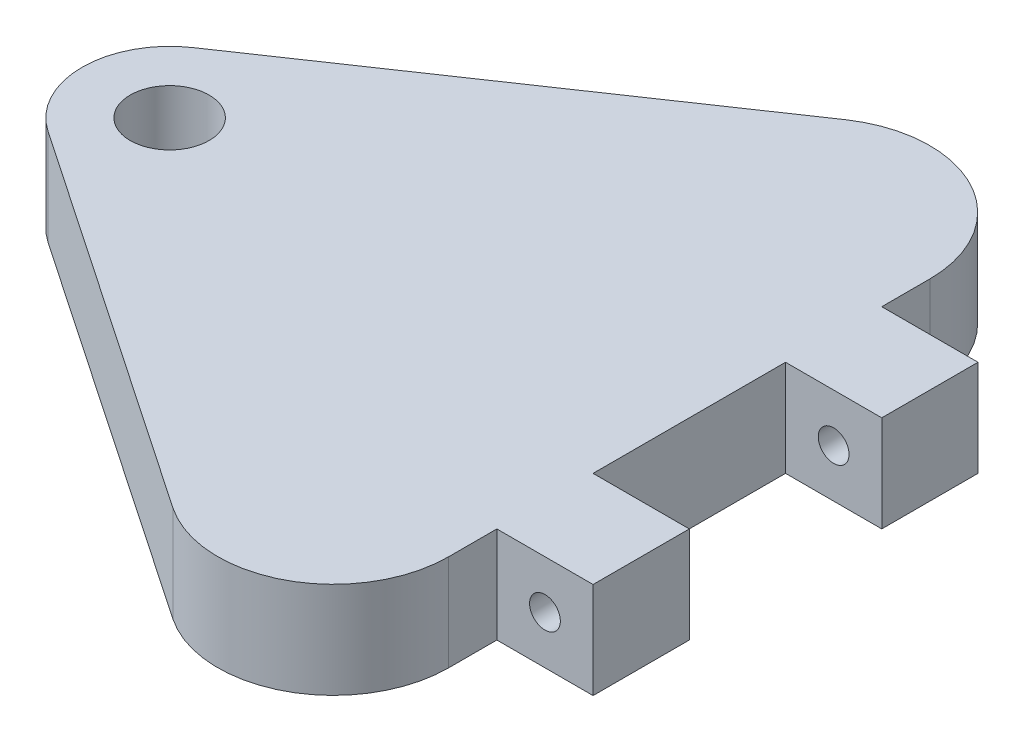
ISO-10303-21;
HEADER;
FILE_DESCRIPTION(('STEP AP214'),'2;1');
FILE_NAME('part.step','',(''),(''),'','','');
FILE_SCHEMA(('AUTOMOTIVE_DESIGN { 1 0 10303 214 1 1 1 1 }'));
ENDSEC;
DATA;
#1=APPLICATION_CONTEXT('core data for automotive mechanical design processes');
#2=APPLICATION_PROTOCOL_DEFINITION('international standard','automotive_design',2000,#1);
#3=PRODUCT_CONTEXT('',#1,'mechanical');
#4=PRODUCT('Part','Part','',(#3));
#5=PRODUCT_RELATED_PRODUCT_CATEGORY('part','',(#4));
#6=PRODUCT_DEFINITION_FORMATION('','',#4);
#7=PRODUCT_DEFINITION_CONTEXT('part definition',#1,'design');
#8=PRODUCT_DEFINITION('design','',#6,#7);
#9=PRODUCT_DEFINITION_SHAPE('','',#8);
#10=(LENGTH_UNIT() NAMED_UNIT(*) SI_UNIT(.MILLI.,.METRE.));
#11=(NAMED_UNIT(*) PLANE_ANGLE_UNIT() SI_UNIT($,.RADIAN.));
#12=(NAMED_UNIT(*) SI_UNIT($,.STERADIAN.) SOLID_ANGLE_UNIT());
#13=UNCERTAINTY_MEASURE_WITH_UNIT(LENGTH_MEASURE(1.E-05),#10,'distance_accuracy_value','');
#14=(GEOMETRIC_REPRESENTATION_CONTEXT(3) GLOBAL_UNCERTAINTY_ASSIGNED_CONTEXT((#13)) GLOBAL_UNIT_ASSIGNED_CONTEXT((#10,
#11,#12)) REPRESENTATION_CONTEXT('',''));
#15=CARTESIAN_POINT('',(0.,0.,0.));
#16=DIRECTION('',(0.,0.,1.));
#17=DIRECTION('',(1.,0.,0.));
#18=AXIS2_PLACEMENT_3D('',#15,#16,#17);
#19=CARTESIAN_POINT('',(12.,10.,-25.));
#20=DIRECTION('',(-1.,0.,0.));
#21=DIRECTION('',(0.,0.,1.));
#22=AXIS2_PLACEMENT_3D('',#19,#20,#21);
#23=PLANE('',#22);
#24=DIRECTION('',(0.,-1.,0.));
#25=VECTOR('',#24,1.);
#26=CARTESIAN_POINT('',(12.,10.,-10.));
#27=LINE('',#26,#25);
#28=CARTESIAN_POINT('',(12.,10.,-10.));
#29=VERTEX_POINT('',#28);
#30=CARTESIAN_POINT('',(12.,0.,-10.));
#31=VERTEX_POINT('',#30);
#32=EDGE_CURVE('E57',#29,#31,#27,.T.);
#33=ORIENTED_EDGE('',*,*,#32,.F.);
#34=DIRECTION('',(0.,0.,-1.));
#35=VECTOR('',#34,1.);
#36=CARTESIAN_POINT('',(12.,10.,-25.));
#37=LINE('',#36,#35);
#38=CARTESIAN_POINT('',(12.,10.,10.));
#39=VERTEX_POINT('',#38);
#40=EDGE_CURVE('E377',#39,#29,#37,.T.);
#41=ORIENTED_EDGE('',*,*,#40,.F.);
#42=DIRECTION('',(0.,1.,0.));
#43=VECTOR('',#42,1.);
#44=CARTESIAN_POINT('',(12.,10.,10.));
#45=LINE('',#44,#43);
#46=CARTESIAN_POINT('',(12.,0.,10.));
#47=VERTEX_POINT('',#46);
#48=EDGE_CURVE('E237',#47,#39,#45,.T.);
#49=ORIENTED_EDGE('',*,*,#48,.F.);
#50=DIRECTION('',(0.,0.,-1.));
#51=VECTOR('',#50,1.);
#52=CARTESIAN_POINT('',(12.,0.,-25.));
#53=LINE('',#52,#51);
#54=EDGE_CURVE('E393',#47,#31,#53,.T.);
#55=ORIENTED_EDGE('',*,*,#54,.T.);
#56=EDGE_LOOP('',(#33,#41,#49,#55));
#57=FACE_BOUND('',#56,.T.);
#58=ADVANCED_FACE('F33',(#57),#23,.F.);
#59=DIRECTION('',(0.,1.,0.));
#60=VECTOR('',#59,1.);
#61=CARTESIAN_POINT('',(12.,10.,-20.));
#62=LINE('',#61,#60);
#63=CARTESIAN_POINT('',(12.,0.,-20.));
#64=VERTEX_POINT('',#63);
#65=CARTESIAN_POINT('',(12.,10.,-20.));
#66=VERTEX_POINT('',#65);
#67=EDGE_CURVE('E231',#64,#66,#62,.T.);
#68=ORIENTED_EDGE('',*,*,#67,.F.);
#69=CARTESIAN_POINT('',(12.,0.,-25.));
#70=VERTEX_POINT('',#69);
#71=EDGE_CURVE('E388',#64,#70,#53,.T.);
#72=ORIENTED_EDGE('',*,*,#71,.T.);
#73=DIRECTION('',(0.,-1.,0.));
#74=VECTOR('',#73,1.);
#75=CARTESIAN_POINT('',(12.,10.,-25.));
#76=LINE('',#75,#74);
#77=CARTESIAN_POINT('',(12.,10.,-25.));
#78=VERTEX_POINT('',#77);
#79=EDGE_CURVE('E401',#78,#70,#76,.T.);
#80=ORIENTED_EDGE('',*,*,#79,.F.);
#81=EDGE_CURVE('E49',#66,#78,#37,.T.);
#82=ORIENTED_EDGE('',*,*,#81,.F.);
#83=EDGE_LOOP('',(#68,#72,#80,#82));
#84=FACE_BOUND('',#83,.T.);
#85=ADVANCED_FACE('F441',(#84),#23,.F.);
#86=DIRECTION('',(0.,-1.,0.));
#87=VECTOR('',#86,1.);
#88=CARTESIAN_POINT('',(12.,10.,20.));
#89=LINE('',#88,#87);
#90=CARTESIAN_POINT('',(12.,10.,20.));
#91=VERTEX_POINT('',#90);
#92=CARTESIAN_POINT('',(12.,0.,20.));
#93=VERTEX_POINT('',#92);
#94=EDGE_CURVE('E234',#91,#93,#89,.T.);
#95=ORIENTED_EDGE('',*,*,#94,.F.);
#96=CARTESIAN_POINT('',(12.,10.,25.));
#97=VERTEX_POINT('',#96);
#98=EDGE_CURVE('E373',#97,#91,#37,.T.);
#99=ORIENTED_EDGE('',*,*,#98,.F.);
#100=DIRECTION('',(0.,-1.,0.));
#101=VECTOR('',#100,1.);
#102=CARTESIAN_POINT('',(12.,10.,25.));
#103=LINE('',#102,#101);
#104=CARTESIAN_POINT('',(12.,0.,25.));
#105=VERTEX_POINT('',#104);
#106=EDGE_CURVE('E404',#97,#105,#103,.T.);
#107=ORIENTED_EDGE('',*,*,#106,.T.);
#108=EDGE_CURVE('E389',#105,#93,#53,.T.);
#109=ORIENTED_EDGE('',*,*,#108,.T.);
#110=EDGE_LOOP('',(#95,#99,#107,#109));
#111=FACE_BOUND('',#110,.T.);
#112=ADVANCED_FACE('F419',(#111),#23,.F.);
#113=CARTESIAN_POINT('',(-42.,10.,0.));
#114=DIRECTION('',(0.,1.,0.));
#115=DIRECTION('',(0.,0.,1.));
#116=AXIS2_PLACEMENT_3D('',#113,#114,#115);
#117=PLANE('',#116);
#118=CARTESIAN_POINT('',(-42.,10.,0.));
#119=DIRECTION('',(0.,1.,0.));
#120=DIRECTION('',(0.,0.,1.));
#121=AXIS2_PLACEMENT_3D('',#118,#119,#120);
#122=CIRCLE('',#121,9.1);
#123=CARTESIAN_POINT('',(-47.1102547182687,10.,-7.52962792669148));
#124=VERTEX_POINT('',#123);
#125=CARTESIAN_POINT('',(-47.1102547182687,10.,7.52962792669148));
#126=VERTEX_POINT('',#125);
#127=EDGE_CURVE('E365',#124,#126,#122,.T.);
#128=ORIENTED_EDGE('',*,*,#127,.T.);
#129=DIRECTION('',(0.827431640295766,0.,0.561566452557004));
#130=VECTOR('',#129,1.);
#131=CARTESIAN_POINT('',(-6.73879743068405,10.,34.9291796835492));
#132=LINE('',#131,#130);
#133=CARTESIAN_POINT('',(-6.73879743068404,10.,34.9291796835492));
#134=VERTEX_POINT('',#133);
#135=EDGE_CURVE('E368',#126,#134,#132,.T.);
#136=ORIENTED_EDGE('',*,*,#135,.T.);
#137=CARTESIAN_POINT('',(0.,10.,25.));
#138=DIRECTION('',(0.,1.,0.));
#139=DIRECTION('',(0.,0.,1.));
#140=AXIS2_PLACEMENT_3D('',#137,#138,#139);
#141=CIRCLE('',#140,12.);
#142=EDGE_CURVE('E371',#134,#97,#141,.T.);
#143=ORIENTED_EDGE('',*,*,#142,.T.);
#144=ORIENTED_EDGE('',*,*,#98,.T.);
#145=DIRECTION('',(-1.,0.,0.));
#146=VECTOR('',#145,1.);
#147=CARTESIAN_POINT('',(22.,10.,20.));
#148=LINE('',#147,#146);
#149=CARTESIAN_POINT('',(22.,10.,20.));
#150=VERTEX_POINT('',#149);
#151=EDGE_CURVE('E251',#150,#91,#148,.T.);
#152=ORIENTED_EDGE('',*,*,#151,.F.);
#153=DIRECTION('',(0.,0.,1.));
#154=VECTOR('',#153,1.);
#155=CARTESIAN_POINT('',(22.,10.,20.));
#156=LINE('',#155,#154);
#157=CARTESIAN_POINT('',(22.,10.,10.));
#158=VERTEX_POINT('',#157);
#159=EDGE_CURVE('E250',#158,#150,#156,.T.);
#160=ORIENTED_EDGE('',*,*,#159,.F.);
#161=DIRECTION('',(-1.,0.,0.));
#162=VECTOR('',#161,1.);
#163=CARTESIAN_POINT('',(22.,10.,10.));
#164=LINE('',#163,#162);
#165=EDGE_CURVE('E256',#158,#39,#164,.T.);
#166=ORIENTED_EDGE('',*,*,#165,.T.);
#167=ORIENTED_EDGE('',*,*,#40,.T.);
#168=DIRECTION('',(-1.,0.,0.));
#169=VECTOR('',#168,1.);
#170=CARTESIAN_POINT('',(22.,10.,-10.));
#171=LINE('',#170,#169);
#172=CARTESIAN_POINT('',(22.,10.,-10.));
#173=VERTEX_POINT('',#172);
#174=EDGE_CURVE('E588',#173,#29,#171,.T.);
#175=ORIENTED_EDGE('',*,*,#174,.F.);
#176=DIRECTION('',(0.,0.,1.));
#177=VECTOR('',#176,1.);
#178=CARTESIAN_POINT('',(22.,10.,-10.));
#179=LINE('',#178,#177);
#180=CARTESIAN_POINT('',(22.,10.,-20.));
#181=VERTEX_POINT('',#180);
#182=EDGE_CURVE('E227',#181,#173,#179,.T.);
#183=ORIENTED_EDGE('',*,*,#182,.F.);
#184=DIRECTION('',(-1.,0.,0.));
#185=VECTOR('',#184,1.);
#186=CARTESIAN_POINT('',(22.,10.,-20.));
#187=LINE('',#186,#185);
#188=EDGE_CURVE('E239',#181,#66,#187,.T.);
#189=ORIENTED_EDGE('',*,*,#188,.T.);
#190=ORIENTED_EDGE('',*,*,#81,.T.);
#191=CARTESIAN_POINT('',(0.,10.,-25.));
#192=DIRECTION('',(0.,1.,0.));
#193=DIRECTION('',(0.,0.,1.));
#194=AXIS2_PLACEMENT_3D('',#191,#192,#193);
#195=CIRCLE('',#194,12.);
#196=CARTESIAN_POINT('',(-6.73879743068404,10.,-34.9291796835492));
#197=VERTEX_POINT('',#196);
#198=EDGE_CURVE('E376',#78,#197,#195,.T.);
#199=ORIENTED_EDGE('',*,*,#198,.T.);
#200=DIRECTION('',(-0.827431640295766,0.,0.561566452557004));
#201=VECTOR('',#200,1.);
#202=CARTESIAN_POINT('',(-47.1102547182687,10.,-7.52962792669148));
#203=LINE('',#202,#201);
#204=EDGE_CURVE('E379',#197,#124,#203,.T.);
#205=ORIENTED_EDGE('',*,*,#204,.T.);
#206=EDGE_LOOP('',(#128,#136,#143,#144,#152,#160,#166,#167,#175,#183,#189,#190,#199,#205));
#207=FACE_BOUND('',#206,.T.);
#208=CARTESIAN_POINT('',(-42.,10.,0.));
#209=DIRECTION('',(0.,1.,0.));
#210=DIRECTION('',(0.,0.,1.));
#211=AXIS2_PLACEMENT_3D('',#208,#209,#210);
#212=CIRCLE('',#211,4.1);
#213=CARTESIAN_POINT('',(-42.,10.,4.10000000000001));
#214=VERTEX_POINT('',#213);
#215=EDGE_CURVE('E359',#214,#214,#212,.T.);
#216=ORIENTED_EDGE('',*,*,#215,.F.);
#217=EDGE_LOOP('',(#216));
#218=FACE_BOUND('',#217,.T.);
#219=ADVANCED_FACE('F423',(#207,#218),#117,.T.);
#220=CARTESIAN_POINT('',(-42.,0.,0.));
#221=DIRECTION('',(0.,1.,0.));
#222=DIRECTION('',(0.,0.,1.));
#223=AXIS2_PLACEMENT_3D('',#220,#221,#222);
#224=PLANE('',#223);
#225=DIRECTION('',(-1.,0.,0.));
#226=VECTOR('',#225,1.);
#227=CARTESIAN_POINT('',(-5.1,0.,30.1));
#228=LINE('',#227,#226);
#229=CARTESIAN_POINT('',(5.1,0.,30.1));
#230=VERTEX_POINT('',#229);
#231=CARTESIAN_POINT('',(-5.1,0.,30.1));
#232=VERTEX_POINT('',#231);
#233=EDGE_CURVE('E279',#230,#232,#228,.T.);
#234=ORIENTED_EDGE('',*,*,#233,.F.);
#235=DIRECTION('',(0.,0.,1.));
#236=VECTOR('',#235,1.);
#237=CARTESIAN_POINT('',(5.1,0.,19.9));
#238=LINE('',#237,#236);
#239=CARTESIAN_POINT('',(5.1,0.,19.9));
#240=VERTEX_POINT('',#239);
#241=EDGE_CURVE('E277',#240,#230,#238,.T.);
#242=ORIENTED_EDGE('',*,*,#241,.F.);
#243=DIRECTION('',(1.,0.,0.));
#244=VECTOR('',#243,1.);
#245=CARTESIAN_POINT('',(-5.1,0.,19.9));
#246=LINE('',#245,#244);
#247=CARTESIAN_POINT('',(-5.1,0.,19.9));
#248=VERTEX_POINT('',#247);
#249=EDGE_CURVE('E267',#248,#240,#246,.T.);
#250=ORIENTED_EDGE('',*,*,#249,.F.);
#251=DIRECTION('',(0.,0.,-1.));
#252=VECTOR('',#251,1.);
#253=CARTESIAN_POINT('',(-5.1,0.,19.9));
#254=LINE('',#253,#252);
#255=EDGE_CURVE('E283',#232,#248,#254,.T.);
#256=ORIENTED_EDGE('',*,*,#255,.F.);
#257=EDGE_LOOP('',(#234,#242,#250,#256));
#258=FACE_BOUND('',#257,.T.);
#259=DIRECTION('',(-1.,0.,0.));
#260=VECTOR('',#259,1.);
#261=CARTESIAN_POINT('',(-5.1,0.,-19.9));
#262=LINE('',#261,#260);
#263=CARTESIAN_POINT('',(5.1,0.,-19.9));
#264=VERTEX_POINT('',#263);
#265=CARTESIAN_POINT('',(-5.1,0.,-19.9));
#266=VERTEX_POINT('',#265);
#267=EDGE_CURVE('E313',#264,#266,#262,.T.);
#268=ORIENTED_EDGE('',*,*,#267,.F.);
#269=DIRECTION('',(0.,0.,1.));
#270=VECTOR('',#269,1.);
#271=CARTESIAN_POINT('',(5.1,0.,-19.9));
#272=LINE('',#271,#270);
#273=CARTESIAN_POINT('',(5.1,0.,-30.1));
#274=VERTEX_POINT('',#273);
#275=EDGE_CURVE('E311',#274,#264,#272,.T.);
#276=ORIENTED_EDGE('',*,*,#275,.F.);
#277=DIRECTION('',(1.,0.,0.));
#278=VECTOR('',#277,1.);
#279=CARTESIAN_POINT('',(-5.1,0.,-30.1));
#280=LINE('',#279,#278);
#281=CARTESIAN_POINT('',(-5.1,0.,-30.1));
#282=VERTEX_POINT('',#281);
#283=EDGE_CURVE('E301',#282,#274,#280,.T.);
#284=ORIENTED_EDGE('',*,*,#283,.F.);
#285=DIRECTION('',(0.,0.,-1.));
#286=VECTOR('',#285,1.);
#287=CARTESIAN_POINT('',(-5.1,0.,-19.9));
#288=LINE('',#287,#286);
#289=EDGE_CURVE('E317',#266,#282,#288,.T.);
#290=ORIENTED_EDGE('',*,*,#289,.F.);
#291=EDGE_LOOP('',(#268,#276,#284,#290));
#292=FACE_BOUND('',#291,.T.);
#293=DIRECTION('',(-1.,0.,0.));
#294=VECTOR('',#293,1.);
#295=CARTESIAN_POINT('',(-25.1,0.,5.1));
#296=LINE('',#295,#294);
#297=CARTESIAN_POINT('',(-14.9,0.,5.1));
#298=VERTEX_POINT('',#297);
#299=CARTESIAN_POINT('',(-25.1,0.,5.1));
#300=VERTEX_POINT('',#299);
#301=EDGE_CURVE('E344',#298,#300,#296,.T.);
#302=ORIENTED_EDGE('',*,*,#301,.F.);
#303=DIRECTION('',(0.,0.,1.));
#304=VECTOR('',#303,1.);
#305=CARTESIAN_POINT('',(-14.9,0.,-5.1));
#306=LINE('',#305,#304);
#307=CARTESIAN_POINT('',(-14.9,0.,-5.1));
#308=VERTEX_POINT('',#307);
#309=EDGE_CURVE('E262',#308,#298,#306,.T.);
#310=ORIENTED_EDGE('',*,*,#309,.F.);
#311=DIRECTION('',(1.,0.,0.));
#312=VECTOR('',#311,1.);
#313=CARTESIAN_POINT('',(-25.1,0.,-5.1));
#314=LINE('',#313,#312);
#315=CARTESIAN_POINT('',(-25.1,0.,-5.1));
#316=VERTEX_POINT('',#315);
#317=EDGE_CURVE('E333',#316,#308,#314,.T.);
#318=ORIENTED_EDGE('',*,*,#317,.F.);
#319=DIRECTION('',(0.,0.,-1.));
#320=VECTOR('',#319,1.);
#321=CARTESIAN_POINT('',(-25.1,0.,-5.1));
#322=LINE('',#321,#320);
#323=EDGE_CURVE('E347',#300,#316,#322,.T.);
#324=ORIENTED_EDGE('',*,*,#323,.F.);
#325=EDGE_LOOP('',(#302,#310,#318,#324));
#326=FACE_BOUND('',#325,.T.);
#327=CARTESIAN_POINT('',(-42.,0.,0.));
#328=DIRECTION('',(0.,1.,0.));
#329=DIRECTION('',(0.,0.,1.));
#330=AXIS2_PLACEMENT_3D('',#327,#328,#329);
#331=CIRCLE('',#330,9.1);
#332=CARTESIAN_POINT('',(-47.1102547182687,0.,-7.52962792669148));
#333=VERTEX_POINT('',#332);
#334=CARTESIAN_POINT('',(-47.1102547182687,0.,7.52962792669148));
#335=VERTEX_POINT('',#334);
#336=EDGE_CURVE('E362',#333,#335,#331,.T.);
#337=ORIENTED_EDGE('',*,*,#336,.F.);
#338=DIRECTION('',(-0.827431640295766,0.,0.561566452557004));
#339=VECTOR('',#338,1.);
#340=CARTESIAN_POINT('',(-47.1102547182687,0.,-7.52962792669148));
#341=LINE('',#340,#339);
#342=CARTESIAN_POINT('',(-6.73879743068404,0.,-34.9291796835492));
#343=VERTEX_POINT('',#342);
#344=EDGE_CURVE('E369',#343,#333,#341,.T.);
#345=ORIENTED_EDGE('',*,*,#344,.F.);
#346=CARTESIAN_POINT('',(0.,0.,-25.));
#347=DIRECTION('',(0.,1.,0.));
#348=DIRECTION('',(0.,0.,1.));
#349=AXIS2_PLACEMENT_3D('',#346,#347,#348);
#350=CIRCLE('',#349,12.);
#351=EDGE_CURVE('E392',#70,#343,#350,.T.);
#352=ORIENTED_EDGE('',*,*,#351,.F.);
#353=ORIENTED_EDGE('',*,*,#71,.F.);
#354=DIRECTION('',(-1.,0.,0.));
#355=VECTOR('',#354,1.);
#356=CARTESIAN_POINT('',(22.,0.,-20.));
#357=LINE('',#356,#355);
#358=CARTESIAN_POINT('',(22.,0.,-20.));
#359=VERTEX_POINT('',#358);
#360=EDGE_CURVE('E218',#359,#64,#357,.T.);
#361=ORIENTED_EDGE('',*,*,#360,.F.);
#362=DIRECTION('',(0.,0.,-1.));
#363=VECTOR('',#362,1.);
#364=CARTESIAN_POINT('',(22.,0.,-10.));
#365=LINE('',#364,#363);
#366=CARTESIAN_POINT('',(22.,0.,-10.));
#367=VERTEX_POINT('',#366);
#368=EDGE_CURVE('E209',#367,#359,#365,.T.);
#369=ORIENTED_EDGE('',*,*,#368,.F.);
#370=DIRECTION('',(-1.,0.,0.));
#371=VECTOR('',#370,1.);
#372=CARTESIAN_POINT('',(22.,0.,-10.));
#373=LINE('',#372,#371);
#374=EDGE_CURVE('E216',#367,#31,#373,.T.);
#375=ORIENTED_EDGE('',*,*,#374,.T.);
#376=ORIENTED_EDGE('',*,*,#54,.F.);
#377=DIRECTION('',(-1.,0.,0.));
#378=VECTOR('',#377,1.);
#379=CARTESIAN_POINT('',(22.,0.,10.));
#380=LINE('',#379,#378);
#381=CARTESIAN_POINT('',(22.,0.,10.));
#382=VERTEX_POINT('',#381);
#383=EDGE_CURVE('E258',#382,#47,#380,.T.);
#384=ORIENTED_EDGE('',*,*,#383,.F.);
#385=DIRECTION('',(0.,0.,-1.));
#386=VECTOR('',#385,1.);
#387=CARTESIAN_POINT('',(22.,0.,20.));
#388=LINE('',#387,#386);
#389=CARTESIAN_POINT('',(22.,0.,20.));
#390=VERTEX_POINT('',#389);
#391=EDGE_CURVE('E246',#390,#382,#388,.T.);
#392=ORIENTED_EDGE('',*,*,#391,.F.);
#393=DIRECTION('',(-1.,0.,0.));
#394=VECTOR('',#393,1.);
#395=CARTESIAN_POINT('',(22.,0.,20.));
#396=LINE('',#395,#394);
#397=EDGE_CURVE('E260',#390,#93,#396,.T.);
#398=ORIENTED_EDGE('',*,*,#397,.T.);
#399=ORIENTED_EDGE('',*,*,#108,.F.);
#400=CARTESIAN_POINT('',(0.,0.,25.));
#401=DIRECTION('',(0.,1.,0.));
#402=DIRECTION('',(0.,0.,1.));
#403=AXIS2_PLACEMENT_3D('',#400,#401,#402);
#404=CIRCLE('',#403,12.);
#405=CARTESIAN_POINT('',(-6.73879743068404,0.,34.9291796835492));
#406=VERTEX_POINT('',#405);
#407=EDGE_CURVE('E386',#406,#105,#404,.T.);
#408=ORIENTED_EDGE('',*,*,#407,.F.);
#409=DIRECTION('',(0.827431640295766,0.,0.561566452557004));
#410=VECTOR('',#409,1.);
#411=CARTESIAN_POINT('',(-6.73879743068405,0.,34.9291796835492));
#412=LINE('',#411,#410);
#413=EDGE_CURVE('E384',#335,#406,#412,.T.);
#414=ORIENTED_EDGE('',*,*,#413,.F.);
#415=EDGE_LOOP('',(#337,#345,#352,#353,#361,#369,#375,#376,#384,#392,#398,#399,#408,#414));
#416=FACE_BOUND('',#415,.T.);
#417=CARTESIAN_POINT('',(-42.,0.,0.));
#418=DIRECTION('',(0.,1.,0.));
#419=DIRECTION('',(0.,0.,1.));
#420=AXIS2_PLACEMENT_3D('',#417,#418,#419);
#421=CIRCLE('',#420,4.1);
#422=CARTESIAN_POINT('',(-42.,0.,4.10000000000001));
#423=VERTEX_POINT('',#422);
#424=EDGE_CURVE('E290',#423,#423,#421,.T.);
#425=ORIENTED_EDGE('',*,*,#424,.T.);
#426=EDGE_LOOP('',(#425));
#427=FACE_BOUND('',#426,.T.);
#428=ADVANCED_FACE('F212',(#258,#292,#326,#416,#427),#224,.F.);
#429=CARTESIAN_POINT('',(-42.,10.,0.));
#430=DIRECTION('',(0.,-1.,0.));
#431=DIRECTION('',(0.,0.,-1.));
#432=AXIS2_PLACEMENT_3D('',#429,#430,#431);
#433=CYLINDRICAL_SURFACE('',#432,9.1);
#434=ORIENTED_EDGE('',*,*,#336,.T.);
#435=DIRECTION('',(0.,-1.,0.));
#436=VECTOR('',#435,1.);
#437=CARTESIAN_POINT('',(-47.1102547182687,10.,7.52962792669148));
#438=LINE('',#437,#436);
#439=EDGE_CURVE('E11',#126,#335,#438,.T.);
#440=ORIENTED_EDGE('',*,*,#439,.F.);
#441=ORIENTED_EDGE('',*,*,#127,.F.);
#442=DIRECTION('',(0.,-1.,0.));
#443=VECTOR('',#442,1.);
#444=CARTESIAN_POINT('',(-47.1102547182687,10.,-7.52962792669148));
#445=LINE('',#444,#443);
#446=EDGE_CURVE('E381',#124,#333,#445,.T.);
#447=ORIENTED_EDGE('',*,*,#446,.T.);
#448=EDGE_LOOP('',(#434,#440,#441,#447));
#449=FACE_BOUND('',#448,.T.);
#450=ADVANCED_FACE('F35',(#449),#433,.T.);
#451=CARTESIAN_POINT('',(-6.73879743068405,10.,34.9291796835492));
#452=DIRECTION('',(0.561566452557004,0.,-0.827431640295766));
#453=DIRECTION('',(-0.827431640295766,0.,-0.561566452557004));
#454=AXIS2_PLACEMENT_3D('',#451,#452,#453);
#455=PLANE('',#454);
#456=ORIENTED_EDGE('',*,*,#413,.T.);
#457=DIRECTION('',(0.,-1.,0.));
#458=VECTOR('',#457,1.);
#459=CARTESIAN_POINT('',(-6.73879743068404,10.,34.9291796835492));
#460=LINE('',#459,#458);
#461=EDGE_CURVE('E42',#134,#406,#460,.T.);
#462=ORIENTED_EDGE('',*,*,#461,.F.);
#463=ORIENTED_EDGE('',*,*,#135,.F.);
#464=ORIENTED_EDGE('',*,*,#439,.T.);
#465=EDGE_LOOP('',(#456,#462,#463,#464));
#466=FACE_BOUND('',#465,.T.);
#467=ADVANCED_FACE('F429',(#466),#455,.F.);
#468=CARTESIAN_POINT('',(0.,10.,25.));
#469=DIRECTION('',(0.,-1.,0.));
#470=DIRECTION('',(0.,0.,-1.));
#471=AXIS2_PLACEMENT_3D('',#468,#469,#470);
#472=CYLINDRICAL_SURFACE('',#471,12.);
#473=ORIENTED_EDGE('',*,*,#407,.T.);
#474=ORIENTED_EDGE('',*,*,#106,.F.);
#475=ORIENTED_EDGE('',*,*,#142,.F.);
#476=ORIENTED_EDGE('',*,*,#461,.T.);
#477=EDGE_LOOP('',(#473,#474,#475,#476));
#478=FACE_BOUND('',#477,.T.);
#479=ADVANCED_FACE('F412',(#478),#472,.T.);
#480=CARTESIAN_POINT('',(0.,10.,-25.));
#481=DIRECTION('',(0.,-1.,0.));
#482=DIRECTION('',(0.,0.,-1.));
#483=AXIS2_PLACEMENT_3D('',#480,#481,#482);
#484=CYLINDRICAL_SURFACE('',#483,12.);
#485=ORIENTED_EDGE('',*,*,#351,.T.);
#486=DIRECTION('',(0.,-1.,0.));
#487=VECTOR('',#486,1.);
#488=CARTESIAN_POINT('',(-6.73879743068404,10.,-34.9291796835492));
#489=LINE('',#488,#487);
#490=EDGE_CURVE('E398',#197,#343,#489,.T.);
#491=ORIENTED_EDGE('',*,*,#490,.F.);
#492=ORIENTED_EDGE('',*,*,#198,.F.);
#493=ORIENTED_EDGE('',*,*,#79,.T.);
#494=EDGE_LOOP('',(#485,#491,#492,#493));
#495=FACE_BOUND('',#494,.T.);
#496=ADVANCED_FACE('F440',(#495),#484,.T.);
#497=CARTESIAN_POINT('',(-47.1102547182687,10.,-7.52962792669148));
#498=DIRECTION('',(0.561566452557004,0.,0.827431640295766));
#499=DIRECTION('',(0.827431640295766,0.,-0.561566452557004));
#500=AXIS2_PLACEMENT_3D('',#497,#498,#499);
#501=PLANE('',#500);
#502=ORIENTED_EDGE('',*,*,#344,.T.);
#503=ORIENTED_EDGE('',*,*,#446,.F.);
#504=ORIENTED_EDGE('',*,*,#204,.F.);
#505=ORIENTED_EDGE('',*,*,#490,.T.);
#506=EDGE_LOOP('',(#502,#503,#504,#505));
#507=FACE_BOUND('',#506,.T.);
#508=ADVANCED_FACE('F435',(#507),#501,.F.);
#509=CARTESIAN_POINT('',(-42.,10.,0.));
#510=DIRECTION('',(0.,-1.,0.));
#511=DIRECTION('',(0.,0.,-1.));
#512=AXIS2_PLACEMENT_3D('',#509,#510,#511);
#513=CYLINDRICAL_SURFACE('',#512,4.1);
#514=ORIENTED_EDGE('',*,*,#215,.T.);
#515=EDGE_LOOP('',(#514));
#516=FACE_BOUND('',#515,.T.);
#517=ORIENTED_EDGE('',*,*,#424,.F.);
#518=EDGE_LOOP('',(#517));
#519=FACE_BOUND('',#518,.T.);
#520=ADVANCED_FACE('F484',(#516,#519),#513,.F.);
#521=CARTESIAN_POINT('',(-14.9,5.,-5.1));
#522=DIRECTION('',(1.,0.,0.));
#523=DIRECTION('',(0.,0.,-1.));
#524=AXIS2_PLACEMENT_3D('',#521,#522,#523);
#525=PLANE('',#524);
#526=ORIENTED_EDGE('',*,*,#309,.T.);
#527=DIRECTION('',(0.,-1.,0.));
#528=VECTOR('',#527,1.);
#529=CARTESIAN_POINT('',(-14.9,5.,5.1));
#530=LINE('',#529,#528);
#531=CARTESIAN_POINT('',(-14.9,5.,5.1));
#532=VERTEX_POINT('',#531);
#533=EDGE_CURVE('E342',#532,#298,#530,.T.);
#534=ORIENTED_EDGE('',*,*,#533,.F.);
#535=DIRECTION('',(0.,0.,1.));
#536=VECTOR('',#535,1.);
#537=CARTESIAN_POINT('',(-14.9,5.,-5.1));
#538=LINE('',#537,#536);
#539=CARTESIAN_POINT('',(-14.9,5.,-5.1));
#540=VERTEX_POINT('',#539);
#541=EDGE_CURVE('E329',#540,#532,#538,.T.);
#542=ORIENTED_EDGE('',*,*,#541,.F.);
#543=DIRECTION('',(0.,-1.,0.));
#544=VECTOR('',#543,1.);
#545=CARTESIAN_POINT('',(-14.9,5.,-5.1));
#546=LINE('',#545,#544);
#547=EDGE_CURVE('E314',#540,#308,#546,.T.);
#548=ORIENTED_EDGE('',*,*,#547,.T.);
#549=EDGE_LOOP('',(#526,#534,#542,#548));
#550=FACE_BOUND('',#549,.T.);
#551=ADVANCED_FACE('F747',(#550),#525,.F.);
#552=CARTESIAN_POINT('',(-25.1,5.,-5.1));
#553=DIRECTION('',(0.,0.,-1.));
#554=DIRECTION('',(-1.,0.,0.));
#555=AXIS2_PLACEMENT_3D('',#552,#553,#554);
#556=PLANE('',#555);
#557=ORIENTED_EDGE('',*,*,#317,.T.);
#558=ORIENTED_EDGE('',*,*,#547,.F.);
#559=DIRECTION('',(1.,0.,0.));
#560=VECTOR('',#559,1.);
#561=CARTESIAN_POINT('',(-25.1,5.,-5.1));
#562=LINE('',#561,#560);
#563=CARTESIAN_POINT('',(-25.1,5.,-5.1));
#564=VERTEX_POINT('',#563);
#565=EDGE_CURVE('E339',#564,#540,#562,.T.);
#566=ORIENTED_EDGE('',*,*,#565,.F.);
#567=DIRECTION('',(0.,-1.,0.));
#568=VECTOR('',#567,1.);
#569=CARTESIAN_POINT('',(-25.1,5.,-5.1));
#570=LINE('',#569,#568);
#571=EDGE_CURVE('E353',#564,#316,#570,.T.);
#572=ORIENTED_EDGE('',*,*,#571,.T.);
#573=EDGE_LOOP('',(#557,#558,#566,#572));
#574=FACE_BOUND('',#573,.T.);
#575=ADVANCED_FACE('F737',(#574),#556,.F.);
#576=CARTESIAN_POINT('',(-25.1,5.,-5.1));
#577=DIRECTION('',(-1.,0.,0.));
#578=DIRECTION('',(0.,0.,1.));
#579=AXIS2_PLACEMENT_3D('',#576,#577,#578);
#580=PLANE('',#579);
#581=ORIENTED_EDGE('',*,*,#323,.T.);
#582=ORIENTED_EDGE('',*,*,#571,.F.);
#583=DIRECTION('',(0.,0.,-1.));
#584=VECTOR('',#583,1.);
#585=CARTESIAN_POINT('',(-25.1,5.,-5.1));
#586=LINE('',#585,#584);
#587=CARTESIAN_POINT('',(-25.1,5.,5.1));
#588=VERTEX_POINT('',#587);
#589=EDGE_CURVE('E336',#588,#564,#586,.T.);
#590=ORIENTED_EDGE('',*,*,#589,.F.);
#591=DIRECTION('',(0.,-1.,0.));
#592=VECTOR('',#591,1.);
#593=CARTESIAN_POINT('',(-25.1,5.,5.1));
#594=LINE('',#593,#592);
#595=EDGE_CURVE('E355',#588,#300,#594,.T.);
#596=ORIENTED_EDGE('',*,*,#595,.T.);
#597=EDGE_LOOP('',(#581,#582,#590,#596));
#598=FACE_BOUND('',#597,.T.);
#599=ADVANCED_FACE('F727',(#598),#580,.F.);
#600=CARTESIAN_POINT('',(-25.1,5.,5.1));
#601=DIRECTION('',(0.,0.,1.));
#602=DIRECTION('',(1.,0.,0.));
#603=AXIS2_PLACEMENT_3D('',#600,#601,#602);
#604=PLANE('',#603);
#605=ORIENTED_EDGE('',*,*,#301,.T.);
#606=ORIENTED_EDGE('',*,*,#595,.F.);
#607=DIRECTION('',(-1.,0.,0.));
#608=VECTOR('',#607,1.);
#609=CARTESIAN_POINT('',(-25.1,5.,5.1));
#610=LINE('',#609,#608);
#611=EDGE_CURVE('E332',#532,#588,#610,.T.);
#612=ORIENTED_EDGE('',*,*,#611,.F.);
#613=ORIENTED_EDGE('',*,*,#533,.T.);
#614=EDGE_LOOP('',(#605,#606,#612,#613));
#615=FACE_BOUND('',#614,.T.);
#616=ADVANCED_FACE('F717',(#615),#604,.F.);
#617=CARTESIAN_POINT('',(0.,5.,0.));
#618=DIRECTION('',(0.,1.,0.));
#619=DIRECTION('',(0.,0.,1.));
#620=AXIS2_PLACEMENT_3D('',#617,#618,#619);
#621=PLANE('',#620);
#622=ORIENTED_EDGE('',*,*,#541,.T.);
#623=ORIENTED_EDGE('',*,*,#611,.T.);
#624=ORIENTED_EDGE('',*,*,#589,.T.);
#625=ORIENTED_EDGE('',*,*,#565,.T.);
#626=EDGE_LOOP('',(#622,#623,#624,#625));
#627=FACE_BOUND('',#626,.T.);
#628=ADVANCED_FACE('F707',(#627),#621,.F.);
#629=CARTESIAN_POINT('',(5.1,5.,-19.9));
#630=DIRECTION('',(1.,0.,0.));
#631=DIRECTION('',(0.,0.,-1.));
#632=AXIS2_PLACEMENT_3D('',#629,#630,#631);
#633=PLANE('',#632);
#634=ORIENTED_EDGE('',*,*,#275,.T.);
#635=DIRECTION('',(0.,-1.,0.));
#636=VECTOR('',#635,1.);
#637=CARTESIAN_POINT('',(5.1,5.,-19.9));
#638=LINE('',#637,#636);
#639=CARTESIAN_POINT('',(5.1,5.,-19.9));
#640=VERTEX_POINT('',#639);
#641=EDGE_CURVE('E310',#640,#264,#638,.T.);
#642=ORIENTED_EDGE('',*,*,#641,.F.);
#643=DIRECTION('',(0.,0.,1.));
#644=VECTOR('',#643,1.);
#645=CARTESIAN_POINT('',(5.1,5.,-19.9));
#646=LINE('',#645,#644);
#647=CARTESIAN_POINT('',(5.1,5.,-30.1));
#648=VERTEX_POINT('',#647);
#649=EDGE_CURVE('E297',#648,#640,#646,.T.);
#650=ORIENTED_EDGE('',*,*,#649,.F.);
#651=DIRECTION('',(0.,-1.,0.));
#652=VECTOR('',#651,1.);
#653=CARTESIAN_POINT('',(5.1,5.,-30.1));
#654=LINE('',#653,#652);
#655=EDGE_CURVE('E280',#648,#274,#654,.T.);
#656=ORIENTED_EDGE('',*,*,#655,.T.);
#657=EDGE_LOOP('',(#634,#642,#650,#656));
#658=FACE_BOUND('',#657,.T.);
#659=ADVANCED_FACE('F697',(#658),#633,.F.);
#660=CARTESIAN_POINT('',(-5.1,5.,-30.1));
#661=DIRECTION('',(0.,0.,-1.));
#662=DIRECTION('',(-1.,0.,0.));
#663=AXIS2_PLACEMENT_3D('',#660,#661,#662);
#664=PLANE('',#663);
#665=ORIENTED_EDGE('',*,*,#283,.T.);
#666=ORIENTED_EDGE('',*,*,#655,.F.);
#667=DIRECTION('',(1.,0.,0.));
#668=VECTOR('',#667,1.);
#669=CARTESIAN_POINT('',(-5.1,5.,-30.1));
#670=LINE('',#669,#668);
#671=CARTESIAN_POINT('',(-5.1,5.,-30.1));
#672=VERTEX_POINT('',#671);
#673=EDGE_CURVE('E307',#672,#648,#670,.T.);
#674=ORIENTED_EDGE('',*,*,#673,.F.);
#675=DIRECTION('',(0.,-1.,0.));
#676=VECTOR('',#675,1.);
#677=CARTESIAN_POINT('',(-5.1,5.,-30.1));
#678=LINE('',#677,#676);
#679=EDGE_CURVE('E323',#672,#282,#678,.T.);
#680=ORIENTED_EDGE('',*,*,#679,.T.);
#681=EDGE_LOOP('',(#665,#666,#674,#680));
#682=FACE_BOUND('',#681,.T.);
#683=ADVANCED_FACE('F687',(#682),#664,.F.);
#684=CARTESIAN_POINT('',(-5.1,5.,-19.9));
#685=DIRECTION('',(-1.,0.,0.));
#686=DIRECTION('',(0.,0.,1.));
#687=AXIS2_PLACEMENT_3D('',#684,#685,#686);
#688=PLANE('',#687);
#689=ORIENTED_EDGE('',*,*,#289,.T.);
#690=ORIENTED_EDGE('',*,*,#679,.F.);
#691=DIRECTION('',(0.,0.,-1.));
#692=VECTOR('',#691,1.);
#693=CARTESIAN_POINT('',(-5.1,5.,-19.9));
#694=LINE('',#693,#692);
#695=CARTESIAN_POINT('',(-5.1,5.,-19.9));
#696=VERTEX_POINT('',#695);
#697=EDGE_CURVE('E304',#696,#672,#694,.T.);
#698=ORIENTED_EDGE('',*,*,#697,.F.);
#699=DIRECTION('',(0.,-1.,0.));
#700=VECTOR('',#699,1.);
#701=CARTESIAN_POINT('',(-5.1,5.,-19.9));
#702=LINE('',#701,#700);
#703=EDGE_CURVE('E325',#696,#266,#702,.T.);
#704=ORIENTED_EDGE('',*,*,#703,.T.);
#705=EDGE_LOOP('',(#689,#690,#698,#704));
#706=FACE_BOUND('',#705,.T.);
#707=ADVANCED_FACE('F677',(#706),#688,.F.);
#708=CARTESIAN_POINT('',(-5.1,5.,-19.9));
#709=DIRECTION('',(0.,0.,1.));
#710=DIRECTION('',(1.,0.,0.));
#711=AXIS2_PLACEMENT_3D('',#708,#709,#710);
#712=PLANE('',#711);
#713=ORIENTED_EDGE('',*,*,#267,.T.);
#714=ORIENTED_EDGE('',*,*,#703,.F.);
#715=DIRECTION('',(-1.,0.,0.));
#716=VECTOR('',#715,1.);
#717=CARTESIAN_POINT('',(-5.1,5.,-19.9));
#718=LINE('',#717,#716);
#719=EDGE_CURVE('E300',#640,#696,#718,.T.);
#720=ORIENTED_EDGE('',*,*,#719,.F.);
#721=ORIENTED_EDGE('',*,*,#641,.T.);
#722=EDGE_LOOP('',(#713,#714,#720,#721));
#723=FACE_BOUND('',#722,.T.);
#724=ADVANCED_FACE('F667',(#723),#712,.F.);
#725=CARTESIAN_POINT('',(0.,5.,0.));
#726=DIRECTION('',(0.,-1.,0.));
#727=DIRECTION('',(0.,0.,-1.));
#728=AXIS2_PLACEMENT_3D('',#725,#726,#727);
#729=PLANE('',#728);
#730=ORIENTED_EDGE('',*,*,#649,.T.);
#731=ORIENTED_EDGE('',*,*,#719,.T.);
#732=ORIENTED_EDGE('',*,*,#697,.T.);
#733=ORIENTED_EDGE('',*,*,#673,.T.);
#734=EDGE_LOOP('',(#730,#731,#732,#733));
#735=FACE_BOUND('',#734,.T.);
#736=ADVANCED_FACE('F657',(#735),#729,.T.);
#737=CARTESIAN_POINT('',(5.1,5.,19.9));
#738=DIRECTION('',(1.,0.,0.));
#739=DIRECTION('',(0.,0.,-1.));
#740=AXIS2_PLACEMENT_3D('',#737,#738,#739);
#741=PLANE('',#740);
#742=ORIENTED_EDGE('',*,*,#241,.T.);
#743=DIRECTION('',(0.,-1.,0.));
#744=VECTOR('',#743,1.);
#745=CARTESIAN_POINT('',(5.1,5.,30.1));
#746=LINE('',#745,#744);
#747=CARTESIAN_POINT('',(5.1,5.,30.1));
#748=VERTEX_POINT('',#747);
#749=EDGE_CURVE('E276',#748,#230,#746,.T.);
#750=ORIENTED_EDGE('',*,*,#749,.F.);
#751=DIRECTION('',(0.,0.,1.));
#752=VECTOR('',#751,1.);
#753=CARTESIAN_POINT('',(5.1,5.,19.9));
#754=LINE('',#753,#752);
#755=CARTESIAN_POINT('',(5.1,5.,19.9));
#756=VERTEX_POINT('',#755);
#757=EDGE_CURVE('E263',#756,#748,#754,.T.);
#758=ORIENTED_EDGE('',*,*,#757,.F.);
#759=DIRECTION('',(0.,-1.,0.));
#760=VECTOR('',#759,1.);
#761=CARTESIAN_POINT('',(5.1,5.,19.9));
#762=LINE('',#761,#760);
#763=EDGE_CURVE('E288',#756,#240,#762,.T.);
#764=ORIENTED_EDGE('',*,*,#763,.T.);
#765=EDGE_LOOP('',(#742,#750,#758,#764));
#766=FACE_BOUND('',#765,.T.);
#767=ADVANCED_FACE('F647',(#766),#741,.F.);
#768=CARTESIAN_POINT('',(-5.1,5.,19.9));
#769=DIRECTION('',(0.,0.,-1.));
#770=DIRECTION('',(-1.,0.,0.));
#771=AXIS2_PLACEMENT_3D('',#768,#769,#770);
#772=PLANE('',#771);
#773=ORIENTED_EDGE('',*,*,#249,.T.);
#774=ORIENTED_EDGE('',*,*,#763,.F.);
#775=DIRECTION('',(1.,0.,0.));
#776=VECTOR('',#775,1.);
#777=CARTESIAN_POINT('',(-5.1,5.,19.9));
#778=LINE('',#777,#776);
#779=CARTESIAN_POINT('',(-5.1,5.,19.9));
#780=VERTEX_POINT('',#779);
#781=EDGE_CURVE('E273',#780,#756,#778,.T.);
#782=ORIENTED_EDGE('',*,*,#781,.F.);
#783=DIRECTION('',(0.,-1.,0.));
#784=VECTOR('',#783,1.);
#785=CARTESIAN_POINT('',(-5.1,5.,19.9));
#786=LINE('',#785,#784);
#787=EDGE_CURVE('E291',#780,#248,#786,.T.);
#788=ORIENTED_EDGE('',*,*,#787,.T.);
#789=EDGE_LOOP('',(#773,#774,#782,#788));
#790=FACE_BOUND('',#789,.T.);
#791=ADVANCED_FACE('F637',(#790),#772,.F.);
#792=CARTESIAN_POINT('',(-5.1,5.,19.9));
#793=DIRECTION('',(-1.,0.,0.));
#794=DIRECTION('',(0.,0.,1.));
#795=AXIS2_PLACEMENT_3D('',#792,#793,#794);
#796=PLANE('',#795);
#797=ORIENTED_EDGE('',*,*,#255,.T.);
#798=ORIENTED_EDGE('',*,*,#787,.F.);
#799=DIRECTION('',(0.,0.,-1.));
#800=VECTOR('',#799,1.);
#801=CARTESIAN_POINT('',(-5.1,5.,19.9));
#802=LINE('',#801,#800);
#803=CARTESIAN_POINT('',(-5.1,5.,30.1));
#804=VERTEX_POINT('',#803);
#805=EDGE_CURVE('E270',#804,#780,#802,.T.);
#806=ORIENTED_EDGE('',*,*,#805,.F.);
#807=DIRECTION('',(0.,-1.,0.));
#808=VECTOR('',#807,1.);
#809=CARTESIAN_POINT('',(-5.1,5.,30.1));
#810=LINE('',#809,#808);
#811=EDGE_CURVE('E293',#804,#232,#810,.T.);
#812=ORIENTED_EDGE('',*,*,#811,.T.);
#813=EDGE_LOOP('',(#797,#798,#806,#812));
#814=FACE_BOUND('',#813,.T.);
#815=ADVANCED_FACE('F627',(#814),#796,.F.);
#816=CARTESIAN_POINT('',(-5.1,5.,30.1));
#817=DIRECTION('',(0.,0.,1.));
#818=DIRECTION('',(1.,0.,0.));
#819=AXIS2_PLACEMENT_3D('',#816,#817,#818);
#820=PLANE('',#819);
#821=ORIENTED_EDGE('',*,*,#233,.T.);
#822=ORIENTED_EDGE('',*,*,#811,.F.);
#823=DIRECTION('',(-1.,0.,0.));
#824=VECTOR('',#823,1.);
#825=CARTESIAN_POINT('',(-5.1,5.,30.1));
#826=LINE('',#825,#824);
#827=EDGE_CURVE('E266',#748,#804,#826,.T.);
#828=ORIENTED_EDGE('',*,*,#827,.F.);
#829=ORIENTED_EDGE('',*,*,#749,.T.);
#830=EDGE_LOOP('',(#821,#822,#828,#829));
#831=FACE_BOUND('',#830,.T.);
#832=ADVANCED_FACE('F462',(#831),#820,.F.);
#833=CARTESIAN_POINT('',(0.,5.,0.));
#834=DIRECTION('',(0.,1.,0.));
#835=DIRECTION('',(0.,0.,1.));
#836=AXIS2_PLACEMENT_3D('',#833,#834,#835);
#837=PLANE('',#836);
#838=ORIENTED_EDGE('',*,*,#757,.T.);
#839=ORIENTED_EDGE('',*,*,#827,.T.);
#840=ORIENTED_EDGE('',*,*,#805,.T.);
#841=ORIENTED_EDGE('',*,*,#781,.T.);
#842=EDGE_LOOP('',(#838,#839,#840,#841));
#843=FACE_BOUND('',#842,.T.);
#844=ADVANCED_FACE('F453',(#843),#837,.F.);
#845=CARTESIAN_POINT('',(22.,10.,20.));
#846=DIRECTION('',(0.,0.,-1.));
#847=DIRECTION('',(-1.,0.,0.));
#848=AXIS2_PLACEMENT_3D('',#845,#846,#847);
#849=PLANE('',#848);
#850=CARTESIAN_POINT('',(17.,5.,20.));
#851=DIRECTION('',(0.,0.,-1.));
#852=DIRECTION('',(-1.,0.,0.));
#853=AXIS2_PLACEMENT_3D('',#850,#851,#852);
#854=CIRCLE('',#853,1.6);
#855=CARTESIAN_POINT('',(15.4,5.,20.));
#856=VERTEX_POINT('',#855);
#857=EDGE_CURVE('E580',#856,#856,#854,.T.);
#858=ORIENTED_EDGE('',*,*,#857,.T.);
#859=EDGE_LOOP('',(#858));
#860=FACE_BOUND('',#859,.T.);
#861=ORIENTED_EDGE('',*,*,#94,.T.);
#862=ORIENTED_EDGE('',*,*,#397,.F.);
#863=DIRECTION('',(0.,-1.,0.));
#864=VECTOR('',#863,1.);
#865=CARTESIAN_POINT('',(22.,10.,20.));
#866=LINE('',#865,#864);
#867=EDGE_CURVE('E243',#150,#390,#866,.T.);
#868=ORIENTED_EDGE('',*,*,#867,.F.);
#869=ORIENTED_EDGE('',*,*,#151,.T.);
#870=EDGE_LOOP('',(#861,#862,#868,#869));
#871=FACE_BOUND('',#870,.T.);
#872=ADVANCED_FACE('F451',(#860,#871),#849,.F.);
#873=CARTESIAN_POINT('',(22.,10.,10.));
#874=DIRECTION('',(0.,0.,1.));
#875=DIRECTION('',(0.,-1.,0.));
#876=AXIS2_PLACEMENT_3D('',#873,#874,#875);
#877=PLANE('',#876);
#878=CARTESIAN_POINT('',(17.,5.,10.));
#879=DIRECTION('',(0.,0.,1.));
#880=DIRECTION('',(0.,-1.,0.));
#881=AXIS2_PLACEMENT_3D('',#878,#879,#880);
#882=CIRCLE('',#881,1.6);
#883=CARTESIAN_POINT('',(17.,3.4,10.));
#884=VERTEX_POINT('',#883);
#885=EDGE_CURVE('E578',#884,#884,#882,.T.);
#886=ORIENTED_EDGE('',*,*,#885,.T.);
#887=EDGE_LOOP('',(#886));
#888=FACE_BOUND('',#887,.T.);
#889=ORIENTED_EDGE('',*,*,#48,.T.);
#890=ORIENTED_EDGE('',*,*,#165,.F.);
#891=DIRECTION('',(0.,1.,0.));
#892=VECTOR('',#891,1.);
#893=CARTESIAN_POINT('',(22.,10.,10.));
#894=LINE('',#893,#892);
#895=EDGE_CURVE('E248',#382,#158,#894,.T.);
#896=ORIENTED_EDGE('',*,*,#895,.F.);
#897=ORIENTED_EDGE('',*,*,#383,.T.);
#898=EDGE_LOOP('',(#889,#890,#896,#897));
#899=FACE_BOUND('',#898,.T.);
#900=ADVANCED_FACE('F447',(#888,#899),#877,.F.);
#901=CARTESIAN_POINT('',(22.,0.,0.));
#902=DIRECTION('',(1.,0.,0.));
#903=DIRECTION('',(0.,0.,-1.));
#904=AXIS2_PLACEMENT_3D('',#901,#902,#903);
#905=PLANE('',#904);
#906=ORIENTED_EDGE('',*,*,#867,.T.);
#907=ORIENTED_EDGE('',*,*,#391,.T.);
#908=ORIENTED_EDGE('',*,*,#895,.T.);
#909=ORIENTED_EDGE('',*,*,#159,.T.);
#910=EDGE_LOOP('',(#906,#907,#908,#909));
#911=FACE_BOUND('',#910,.T.);
#912=ADVANCED_FACE('F449',(#911),#905,.T.);
#913=CARTESIAN_POINT('',(22.,10.,-10.));
#914=DIRECTION('',(0.,0.,-1.));
#915=DIRECTION('',(0.,1.,0.));
#916=AXIS2_PLACEMENT_3D('',#913,#914,#915);
#917=PLANE('',#916);
#918=CARTESIAN_POINT('',(17.,5.,-10.));
#919=DIRECTION('',(0.,0.,-1.));
#920=DIRECTION('',(0.,1.,0.));
#921=AXIS2_PLACEMENT_3D('',#918,#919,#920);
#922=CIRCLE('',#921,1.6);
#923=CARTESIAN_POINT('',(17.,6.6,-10.));
#924=VERTEX_POINT('',#923);
#925=EDGE_CURVE('E583',#924,#924,#922,.T.);
#926=ORIENTED_EDGE('',*,*,#925,.T.);
#927=EDGE_LOOP('',(#926));
#928=FACE_BOUND('',#927,.T.);
#929=ORIENTED_EDGE('',*,*,#32,.T.);
#930=ORIENTED_EDGE('',*,*,#374,.F.);
#931=DIRECTION('',(0.,-1.,0.));
#932=VECTOR('',#931,1.);
#933=CARTESIAN_POINT('',(22.,10.,-10.));
#934=LINE('',#933,#932);
#935=EDGE_CURVE('E222',#173,#367,#934,.T.);
#936=ORIENTED_EDGE('',*,*,#935,.F.);
#937=ORIENTED_EDGE('',*,*,#174,.T.);
#938=EDGE_LOOP('',(#929,#930,#936,#937));
#939=FACE_BOUND('',#938,.T.);
#940=ADVANCED_FACE('F233',(#928,#939),#917,.F.);
#941=CARTESIAN_POINT('',(22.,10.,-20.));
#942=DIRECTION('',(0.,0.,1.));
#943=DIRECTION('',(1.,0.,0.));
#944=AXIS2_PLACEMENT_3D('',#941,#942,#943);
#945=PLANE('',#944);
#946=CARTESIAN_POINT('',(17.,5.,-20.));
#947=DIRECTION('',(0.,0.,1.));
#948=DIRECTION('',(1.,0.,0.));
#949=AXIS2_PLACEMENT_3D('',#946,#947,#948);
#950=CIRCLE('',#949,1.6);
#951=CARTESIAN_POINT('',(18.6,5.,-20.));
#952=VERTEX_POINT('',#951);
#953=EDGE_CURVE('E37',#952,#952,#950,.T.);
#954=ORIENTED_EDGE('',*,*,#953,.T.);
#955=EDGE_LOOP('',(#954));
#956=FACE_BOUND('',#955,.T.);
#957=ORIENTED_EDGE('',*,*,#67,.T.);
#958=ORIENTED_EDGE('',*,*,#188,.F.);
#959=DIRECTION('',(0.,1.,0.));
#960=VECTOR('',#959,1.);
#961=CARTESIAN_POINT('',(22.,10.,-20.));
#962=LINE('',#961,#960);
#963=EDGE_CURVE('E221',#359,#181,#962,.T.);
#964=ORIENTED_EDGE('',*,*,#963,.F.);
#965=ORIENTED_EDGE('',*,*,#360,.T.);
#966=EDGE_LOOP('',(#957,#958,#964,#965));
#967=FACE_BOUND('',#966,.T.);
#968=ADVANCED_FACE('F528',(#956,#967),#945,.F.);
#969=CARTESIAN_POINT('',(22.,0.,0.));
#970=DIRECTION('',(1.,0.,0.));
#971=DIRECTION('',(0.,0.,-1.));
#972=AXIS2_PLACEMENT_3D('',#969,#970,#971);
#973=PLANE('',#972);
#974=ORIENTED_EDGE('',*,*,#935,.T.);
#975=ORIENTED_EDGE('',*,*,#368,.T.);
#976=ORIENTED_EDGE('',*,*,#963,.T.);
#977=ORIENTED_EDGE('',*,*,#182,.T.);
#978=EDGE_LOOP('',(#974,#975,#976,#977));
#979=FACE_BOUND('',#978,.T.);
#980=ADVANCED_FACE('F225',(#979),#973,.T.);
#981=CARTESIAN_POINT('',(17.,5.,-37.));
#982=DIRECTION('',(0.,0.,1.));
#983=DIRECTION('',(1.,0.,0.));
#984=AXIS2_PLACEMENT_3D('',#981,#982,#983);
#985=CYLINDRICAL_SURFACE('',#984,1.6);
#986=ORIENTED_EDGE('',*,*,#953,.F.);
#987=EDGE_LOOP('',(#986));
#988=FACE_BOUND('',#987,.T.);
#989=ORIENTED_EDGE('',*,*,#925,.F.);
#990=EDGE_LOOP('',(#989));
#991=FACE_BOUND('',#990,.T.);
#992=ADVANCED_FACE('F527',(#988,#991),#985,.F.);
#993=ORIENTED_EDGE('',*,*,#885,.F.);
#994=EDGE_LOOP('',(#993));
#995=FACE_BOUND('',#994,.T.);
#996=ORIENTED_EDGE('',*,*,#857,.F.);
#997=EDGE_LOOP('',(#996));
#998=FACE_BOUND('',#997,.T.);
#999=ADVANCED_FACE('F562',(#995,#998),#985,.F.);
#1000=CLOSED_SHELL('',(#58,#85,#112,#219,#428,#450,#467,#479,#496,#508,#520,#551,#575,#599,#616,
#628,#659,#683,#707,#724,#736,#767,#791,#815,#832,#844,#872,#900,#912,#940,#968,#980,#992,#999));
#1001=MANIFOLD_SOLID_BREP('B2',#1000);
#1002=ADVANCED_BREP_SHAPE_REPRESENTATION('',(#18,#1001),#14);
#1003=SHAPE_DEFINITION_REPRESENTATION(#9,#1002);
ENDSEC;
END-ISO-10303-21;
